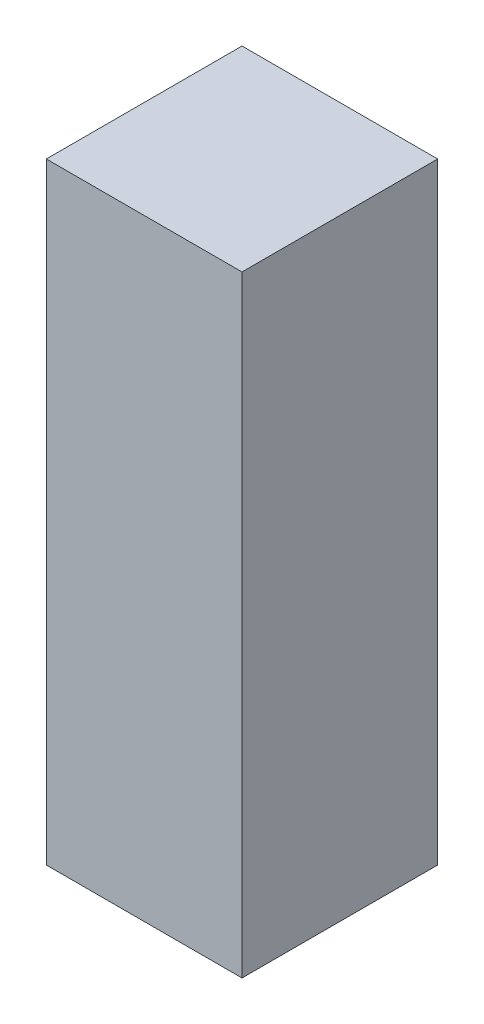
ISO-10303-21;
HEADER;
FILE_DESCRIPTION(('STEP AP214'),'2;1');
FILE_NAME('part.step','',(''),(''),'','','');
FILE_SCHEMA(('AUTOMOTIVE_DESIGN { 1 0 10303 214 1 1 1 1 }'));
ENDSEC;
DATA;
#1=APPLICATION_CONTEXT('core data for automotive mechanical design processes');
#2=APPLICATION_PROTOCOL_DEFINITION('international standard','automotive_design',2000,#1);
#3=PRODUCT_CONTEXT('',#1,'mechanical');
#4=PRODUCT('Part','Part','',(#3));
#5=PRODUCT_RELATED_PRODUCT_CATEGORY('part','',(#4));
#6=PRODUCT_DEFINITION_FORMATION('','',#4);
#7=PRODUCT_DEFINITION_CONTEXT('part definition',#1,'design');
#8=PRODUCT_DEFINITION('design','',#6,#7);
#9=PRODUCT_DEFINITION_SHAPE('','',#8);
#10=(LENGTH_UNIT() NAMED_UNIT(*) SI_UNIT(.MILLI.,.METRE.));
#11=(NAMED_UNIT(*) PLANE_ANGLE_UNIT() SI_UNIT($,.RADIAN.));
#12=(NAMED_UNIT(*) SI_UNIT($,.STERADIAN.) SOLID_ANGLE_UNIT());
#13=UNCERTAINTY_MEASURE_WITH_UNIT(LENGTH_MEASURE(1.E-05),#10,'distance_accuracy_value','');
#14=(GEOMETRIC_REPRESENTATION_CONTEXT(3) GLOBAL_UNCERTAINTY_ASSIGNED_CONTEXT((#13)) GLOBAL_UNIT_ASSIGNED_CONTEXT((#10,
#11,#12)) REPRESENTATION_CONTEXT('',''));
#15=CARTESIAN_POINT('',(0.,0.,0.));
#16=DIRECTION('',(0.,0.,1.));
#17=DIRECTION('',(1.,0.,0.));
#18=AXIS2_PLACEMENT_3D('',#15,#16,#17);
#19=CARTESIAN_POINT('',(-51.7257785467128,250.,-52.1651980029239));
#20=DIRECTION('',(1.,0.,0.));
#21=DIRECTION('',(0.,0.,-1.));
#22=AXIS2_PLACEMENT_3D('',#19,#20,#21);
#23=PLANE('',#22);
#24=DIRECTION('',(0.,0.,1.));
#25=VECTOR('',#24,1.);
#26=CARTESIAN_POINT('',(-51.7257785467128,0.,-52.1651980029239));
#27=LINE('',#26,#25);
#28=CARTESIAN_POINT('',(-51.7257785467128,0.,-52.1651980029239));
#29=VERTEX_POINT('',#28);
#30=CARTESIAN_POINT('',(-51.7257785467128,0.,27.8348019970761));
#31=VERTEX_POINT('',#30);
#32=EDGE_CURVE('E106',#29,#31,#27,.T.);
#33=ORIENTED_EDGE('',*,*,#32,.T.);
#34=DIRECTION('',(0.,-1.,0.));
#35=VECTOR('',#34,1.);
#36=CARTESIAN_POINT('',(-51.7257785467128,250.,27.8348019970761));
#37=LINE('',#36,#35);
#38=CARTESIAN_POINT('',(-51.7257785467128,250.,27.8348019970761));
#39=VERTEX_POINT('',#38);
#40=EDGE_CURVE('E11',#39,#31,#37,.T.);
#41=ORIENTED_EDGE('',*,*,#40,.F.);
#42=DIRECTION('',(0.,0.,1.));
#43=VECTOR('',#42,1.);
#44=CARTESIAN_POINT('',(-51.7257785467128,250.,-52.1651980029239));
#45=LINE('',#44,#43);
#46=CARTESIAN_POINT('',(-51.7257785467128,250.,-52.1651980029239));
#47=VERTEX_POINT('',#46);
#48=EDGE_CURVE('E94',#47,#39,#45,.T.);
#49=ORIENTED_EDGE('',*,*,#48,.F.);
#50=DIRECTION('',(0.,-1.,0.));
#51=VECTOR('',#50,1.);
#52=CARTESIAN_POINT('',(-51.7257785467128,250.,-52.1651980029239));
#53=LINE('',#52,#51);
#54=EDGE_CURVE('E102',#47,#29,#53,.T.);
#55=ORIENTED_EDGE('',*,*,#54,.T.);
#56=EDGE_LOOP('',(#33,#41,#49,#55));
#57=FACE_BOUND('',#56,.T.);
#58=ADVANCED_FACE('F43',(#57),#23,.F.);
#59=CARTESIAN_POINT('',(-51.7257785467128,250.,27.8348019970761));
#60=DIRECTION('',(0.,0.,-1.));
#61=DIRECTION('',(-1.,0.,0.));
#62=AXIS2_PLACEMENT_3D('',#59,#60,#61);
#63=PLANE('',#62);
#64=DIRECTION('',(1.,0.,0.));
#65=VECTOR('',#64,1.);
#66=CARTESIAN_POINT('',(-51.7257785467128,0.,27.8348019970761));
#67=LINE('',#66,#65);
#68=CARTESIAN_POINT('',(28.2742214532872,0.,27.8348019970761));
#69=VERTEX_POINT('',#68);
#70=EDGE_CURVE('E98',#31,#69,#67,.T.);
#71=ORIENTED_EDGE('',*,*,#70,.T.);
#72=DIRECTION('',(0.,-1.,0.));
#73=VECTOR('',#72,1.);
#74=CARTESIAN_POINT('',(28.2742214532872,250.,27.8348019970761));
#75=LINE('',#74,#73);
#76=CARTESIAN_POINT('',(28.2742214532872,250.,27.8348019970761));
#77=VERTEX_POINT('',#76);
#78=EDGE_CURVE('E51',#77,#69,#75,.T.);
#79=ORIENTED_EDGE('',*,*,#78,.F.);
#80=DIRECTION('',(1.,0.,0.));
#81=VECTOR('',#80,1.);
#82=CARTESIAN_POINT('',(-51.7257785467128,250.,27.8348019970761));
#83=LINE('',#82,#81);
#84=EDGE_CURVE('E89',#39,#77,#83,.T.);
#85=ORIENTED_EDGE('',*,*,#84,.F.);
#86=ORIENTED_EDGE('',*,*,#40,.T.);
#87=EDGE_LOOP('',(#71,#79,#85,#86));
#88=FACE_BOUND('',#87,.T.);
#89=ADVANCED_FACE('F97',(#88),#63,.F.);
#90=CARTESIAN_POINT('',(28.2742214532872,250.,-52.1651980029239));
#91=DIRECTION('',(-1.,0.,0.));
#92=DIRECTION('',(0.,0.,1.));
#93=AXIS2_PLACEMENT_3D('',#90,#91,#92);
#94=PLANE('',#93);
#95=DIRECTION('',(0.,0.,-1.));
#96=VECTOR('',#95,1.);
#97=CARTESIAN_POINT('',(28.2742214532872,0.,-52.1651980029239));
#98=LINE('',#97,#96);
#99=CARTESIAN_POINT('',(28.2742214532872,0.,-52.1651980029239));
#100=VERTEX_POINT('',#99);
#101=EDGE_CURVE('E76',#69,#100,#98,.T.);
#102=ORIENTED_EDGE('',*,*,#101,.T.);
#103=DIRECTION('',(0.,-1.,0.));
#104=VECTOR('',#103,1.);
#105=CARTESIAN_POINT('',(28.2742214532872,250.,-52.1651980029239));
#106=LINE('',#105,#104);
#107=CARTESIAN_POINT('',(28.2742214532872,250.,-52.1651980029239));
#108=VERTEX_POINT('',#107);
#109=EDGE_CURVE('E99',#108,#100,#106,.T.);
#110=ORIENTED_EDGE('',*,*,#109,.F.);
#111=DIRECTION('',(0.,0.,-1.));
#112=VECTOR('',#111,1.);
#113=CARTESIAN_POINT('',(28.2742214532872,250.,-52.1651980029239));
#114=LINE('',#113,#112);
#115=EDGE_CURVE('E92',#77,#108,#114,.T.);
#116=ORIENTED_EDGE('',*,*,#115,.F.);
#117=ORIENTED_EDGE('',*,*,#78,.T.);
#118=EDGE_LOOP('',(#102,#110,#116,#117));
#119=FACE_BOUND('',#118,.T.);
#120=ADVANCED_FACE('F100',(#119),#94,.F.);
#121=CARTESIAN_POINT('',(-51.7257785467128,250.,-52.1651980029239));
#122=DIRECTION('',(0.,0.,1.));
#123=DIRECTION('',(1.,0.,0.));
#124=AXIS2_PLACEMENT_3D('',#121,#122,#123);
#125=PLANE('',#124);
#126=DIRECTION('',(-1.,0.,0.));
#127=VECTOR('',#126,1.);
#128=CARTESIAN_POINT('',(-51.7257785467128,0.,-52.1651980029239));
#129=LINE('',#128,#127);
#130=EDGE_CURVE('E82',#100,#29,#129,.T.);
#131=ORIENTED_EDGE('',*,*,#130,.T.);
#132=ORIENTED_EDGE('',*,*,#54,.F.);
#133=DIRECTION('',(-1.,0.,0.));
#134=VECTOR('',#133,1.);
#135=CARTESIAN_POINT('',(-51.7257785467128,250.,-52.1651980029239));
#136=LINE('',#135,#134);
#137=EDGE_CURVE('E59',#108,#47,#136,.T.);
#138=ORIENTED_EDGE('',*,*,#137,.F.);
#139=ORIENTED_EDGE('',*,*,#109,.T.);
#140=EDGE_LOOP('',(#131,#132,#138,#139));
#141=FACE_BOUND('',#140,.T.);
#142=ADVANCED_FACE('F113',(#141),#125,.F.);
#143=CARTESIAN_POINT('',(0.,250.,0.));
#144=DIRECTION('',(0.,1.,0.));
#145=DIRECTION('',(0.,0.,1.));
#146=AXIS2_PLACEMENT_3D('',#143,#144,#145);
#147=PLANE('',#146);
#148=ORIENTED_EDGE('',*,*,#48,.T.);
#149=ORIENTED_EDGE('',*,*,#84,.T.);
#150=ORIENTED_EDGE('',*,*,#115,.T.);
#151=ORIENTED_EDGE('',*,*,#137,.T.);
#152=EDGE_LOOP('',(#148,#149,#150,#151));
#153=FACE_BOUND('',#152,.T.);
#154=ADVANCED_FACE('F90',(#153),#147,.T.);
#155=CARTESIAN_POINT('',(0.,0.,0.));
#156=DIRECTION('',(0.,1.,0.));
#157=DIRECTION('',(0.,0.,1.));
#158=AXIS2_PLACEMENT_3D('',#155,#156,#157);
#159=PLANE('',#158);
#160=ORIENTED_EDGE('',*,*,#32,.F.);
#161=ORIENTED_EDGE('',*,*,#130,.F.);
#162=ORIENTED_EDGE('',*,*,#101,.F.);
#163=ORIENTED_EDGE('',*,*,#70,.F.);
#164=EDGE_LOOP('',(#160,#161,#162,#163));
#165=FACE_BOUND('',#164,.T.);
#166=ADVANCED_FACE('F116',(#165),#159,.F.);
#167=CLOSED_SHELL('',(#58,#89,#120,#142,#154,#166));
#168=MANIFOLD_SOLID_BREP('B2',#167);
#169=ADVANCED_BREP_SHAPE_REPRESENTATION('',(#18,#168),#14);
#170=SHAPE_DEFINITION_REPRESENTATION(#9,#169);
ENDSEC;
END-ISO-10303-21;
